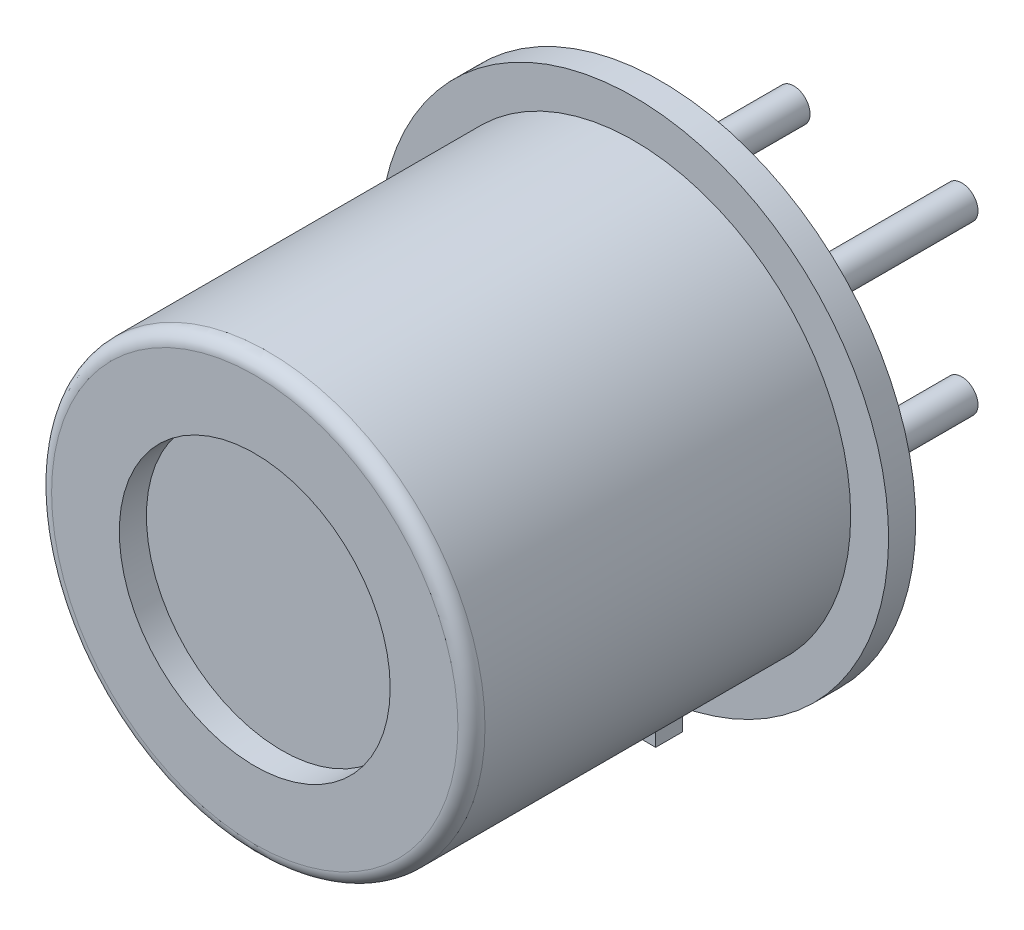
ISO-10303-21;
HEADER;
FILE_DESCRIPTION(('STEP AP214'),'2;1');
FILE_NAME('part.step','',(''),(''),'','','');
FILE_SCHEMA(('AUTOMOTIVE_DESIGN { 1 0 10303 214 1 1 1 1 }'));
ENDSEC;
DATA;
#1=APPLICATION_CONTEXT('core data for automotive mechanical design processes');
#2=APPLICATION_PROTOCOL_DEFINITION('international standard','automotive_design',2000,#1);
#3=PRODUCT_CONTEXT('',#1,'mechanical');
#4=PRODUCT('Part','Part','',(#3));
#5=PRODUCT_RELATED_PRODUCT_CATEGORY('part','',(#4));
#6=PRODUCT_DEFINITION_FORMATION('','',#4);
#7=PRODUCT_DEFINITION_CONTEXT('part definition',#1,'design');
#8=PRODUCT_DEFINITION('design','',#6,#7);
#9=PRODUCT_DEFINITION_SHAPE('','',#8);
#10=(LENGTH_UNIT() NAMED_UNIT(*) SI_UNIT(.MILLI.,.METRE.));
#11=(NAMED_UNIT(*) PLANE_ANGLE_UNIT() SI_UNIT($,.RADIAN.));
#12=(NAMED_UNIT(*) SI_UNIT($,.STERADIAN.) SOLID_ANGLE_UNIT());
#13=UNCERTAINTY_MEASURE_WITH_UNIT(LENGTH_MEASURE(1.E-05),#10,'distance_accuracy_value','');
#14=(GEOMETRIC_REPRESENTATION_CONTEXT(3) GLOBAL_UNCERTAINTY_ASSIGNED_CONTEXT((#13)) GLOBAL_UNIT_ASSIGNED_CONTEXT((#10,
#11,#12)) REPRESENTATION_CONTEXT('',''));
#15=CARTESIAN_POINT('',(0.,0.,0.));
#16=DIRECTION('',(0.,0.,1.));
#17=DIRECTION('',(1.,0.,0.));
#18=AXIS2_PLACEMENT_3D('',#15,#16,#17);
#19=CARTESIAN_POINT('',(-1.55,1.55,-2.));
#20=DIRECTION('',(0.,0.,1.));
#21=DIRECTION('',(1.,0.,0.));
#22=AXIS2_PLACEMENT_3D('',#19,#20,#21);
#23=CYLINDRICAL_SURFACE('',#22,0.3);
#24=CARTESIAN_POINT('',(-1.55,1.55,-2.));
#25=DIRECTION('',(0.,0.,1.));
#26=DIRECTION('',(1.,0.,0.));
#27=AXIS2_PLACEMENT_3D('',#24,#25,#26);
#28=CIRCLE('',#27,0.3);
#29=CARTESIAN_POINT('',(-1.25,1.55,-2.));
#30=VERTEX_POINT('',#29);
#31=EDGE_CURVE('E124',#30,#30,#28,.T.);
#32=ORIENTED_EDGE('',*,*,#31,.T.);
#33=EDGE_LOOP('',(#32));
#34=FACE_BOUND('',#33,.T.);
#35=CARTESIAN_POINT('',(-1.55,1.55,2.));
#36=DIRECTION('',(0.,0.,1.));
#37=DIRECTION('',(1.,0.,0.));
#38=AXIS2_PLACEMENT_3D('',#35,#36,#37);
#39=CIRCLE('',#38,0.3);
#40=CARTESIAN_POINT('',(-1.25,1.55,2.));
#41=VERTEX_POINT('',#40);
#42=EDGE_CURVE('E121',#41,#41,#39,.T.);
#43=ORIENTED_EDGE('',*,*,#42,.F.);
#44=EDGE_LOOP('',(#43));
#45=FACE_BOUND('',#44,.T.);
#46=ADVANCED_FACE('F42',(#34,#45),#23,.T.);
#47=CARTESIAN_POINT('',(-1.55,1.55,-2.));
#48=DIRECTION('',(0.,0.,1.));
#49=DIRECTION('',(1.,0.,0.));
#50=AXIS2_PLACEMENT_3D('',#47,#48,#49);
#51=PLANE('',#50);
#52=ORIENTED_EDGE('',*,*,#31,.F.);
#53=EDGE_LOOP('',(#52));
#54=FACE_BOUND('',#53,.T.);
#55=ADVANCED_FACE('F176',(#54),#51,.F.);
#56=CARTESIAN_POINT('',(0.,-5.5,2.5));
#57=DIRECTION('',(0.,1.,0.));
#58=DIRECTION('',(0.,0.,1.));
#59=AXIS2_PLACEMENT_3D('',#56,#57,#58);
#60=PLANE('',#59);
#61=DIRECTION('',(1.,0.,0.));
#62=VECTOR('',#61,1.);
#63=CARTESIAN_POINT('',(0.,-5.5,2.));
#64=LINE('',#63,#62);
#65=CARTESIAN_POINT('',(-0.4,-5.5,2.));
#66=VERTEX_POINT('',#65);
#67=CARTESIAN_POINT('',(0.4,-5.5,2.));
#68=VERTEX_POINT('',#67);
#69=EDGE_CURVE('E83',#66,#68,#64,.T.);
#70=ORIENTED_EDGE('',*,*,#69,.T.);
#71=DIRECTION('',(0.,0.,-1.));
#72=VECTOR('',#71,1.);
#73=CARTESIAN_POINT('',(0.4,-5.5,2.5));
#74=LINE('',#73,#72);
#75=CARTESIAN_POINT('',(0.4,-5.5,2.5));
#76=VERTEX_POINT('',#75);
#77=EDGE_CURVE('E102',#76,#68,#74,.T.);
#78=ORIENTED_EDGE('',*,*,#77,.F.);
#79=DIRECTION('',(1.,0.,0.));
#80=VECTOR('',#79,1.);
#81=CARTESIAN_POINT('',(0.,-5.5,2.5));
#82=LINE('',#81,#80);
#83=CARTESIAN_POINT('',(-0.4,-5.5,2.5));
#84=VERTEX_POINT('',#83);
#85=EDGE_CURVE('E88',#84,#76,#82,.T.);
#86=ORIENTED_EDGE('',*,*,#85,.F.);
#87=DIRECTION('',(0.,0.,-1.));
#88=VECTOR('',#87,1.);
#89=CARTESIAN_POINT('',(-0.4,-5.5,2.5));
#90=LINE('',#89,#88);
#91=EDGE_CURVE('E107',#84,#66,#90,.T.);
#92=ORIENTED_EDGE('',*,*,#91,.T.);
#93=EDGE_LOOP('',(#70,#78,#86,#92));
#94=FACE_BOUND('',#93,.T.);
#95=ADVANCED_FACE('F181',(#94),#60,.F.);
#96=CARTESIAN_POINT('',(0.4,-5.5,2.5));
#97=DIRECTION('',(-1.,0.,0.));
#98=DIRECTION('',(0.,-1.,0.));
#99=AXIS2_PLACEMENT_3D('',#96,#97,#98);
#100=PLANE('',#99);
#101=DIRECTION('',(0.,1.,0.));
#102=VECTOR('',#101,1.);
#103=CARTESIAN_POINT('',(0.4,-5.5,2.));
#104=LINE('',#103,#102);
#105=CARTESIAN_POINT('',(0.4,-4.68294778958724,2.));
#106=VERTEX_POINT('',#105);
#107=EDGE_CURVE('E101',#68,#106,#104,.T.);
#108=ORIENTED_EDGE('',*,*,#107,.T.);
#109=DIRECTION('',(0.,0.,-1.));
#110=VECTOR('',#109,1.);
#111=CARTESIAN_POINT('',(0.4,-4.68294778958724,2.5));
#112=LINE('',#111,#110);
#113=CARTESIAN_POINT('',(0.4,-4.68294778958724,2.5));
#114=VERTEX_POINT('',#113);
#115=EDGE_CURVE('E99',#114,#106,#112,.T.);
#116=ORIENTED_EDGE('',*,*,#115,.F.);
#117=DIRECTION('',(0.,1.,0.));
#118=VECTOR('',#117,1.);
#119=CARTESIAN_POINT('',(0.4,-5.5,2.5));
#120=LINE('',#119,#118);
#121=EDGE_CURVE('E91',#76,#114,#120,.T.);
#122=ORIENTED_EDGE('',*,*,#121,.F.);
#123=ORIENTED_EDGE('',*,*,#77,.T.);
#124=EDGE_LOOP('',(#108,#116,#122,#123));
#125=FACE_BOUND('',#124,.T.);
#126=ADVANCED_FACE('F100',(#125),#100,.F.);
#127=CARTESIAN_POINT('',(0.,0.,2.5));
#128=DIRECTION('',(0.,0.,-1.));
#129=DIRECTION('',(-1.,0.,0.));
#130=AXIS2_PLACEMENT_3D('',#127,#128,#129);
#131=CYLINDRICAL_SURFACE('',#130,4.7);
#132=CARTESIAN_POINT('',(0.,0.,2.));
#133=DIRECTION('',(0.,0.,1.));
#134=DIRECTION('',(1.,0.,0.));
#135=AXIS2_PLACEMENT_3D('',#132,#133,#134);
#136=CIRCLE('',#135,4.7);
#137=CARTESIAN_POINT('',(-0.399999999999997,-4.68294778958724,2.));
#138=VERTEX_POINT('',#137);
#139=EDGE_CURVE('E76',#106,#138,#136,.T.);
#140=ORIENTED_EDGE('',*,*,#139,.T.);
#141=DIRECTION('',(0.,0.,-1.));
#142=VECTOR('',#141,1.);
#143=CARTESIAN_POINT('',(-0.399999999999997,-4.68294778958724,2.5));
#144=LINE('',#143,#142);
#145=CARTESIAN_POINT('',(-0.399999999999997,-4.68294778958724,2.5));
#146=VERTEX_POINT('',#145);
#147=EDGE_CURVE('E103',#146,#138,#144,.T.);
#148=ORIENTED_EDGE('',*,*,#147,.F.);
#149=CARTESIAN_POINT('',(0.,0.,2.5));
#150=DIRECTION('',(0.,0.,1.));
#151=DIRECTION('',(1.,0.,0.));
#152=AXIS2_PLACEMENT_3D('',#149,#150,#151);
#153=CIRCLE('',#152,4.7);
#154=EDGE_CURVE('E95',#114,#146,#153,.T.);
#155=ORIENTED_EDGE('',*,*,#154,.F.);
#156=ORIENTED_EDGE('',*,*,#115,.T.);
#157=EDGE_LOOP('',(#140,#148,#155,#156));
#158=FACE_BOUND('',#157,.T.);
#159=ADVANCED_FACE('F105',(#158),#131,.T.);
#160=CARTESIAN_POINT('',(-0.4,-5.5,2.5));
#161=DIRECTION('',(1.,0.,0.));
#162=DIRECTION('',(0.,1.,0.));
#163=AXIS2_PLACEMENT_3D('',#160,#161,#162);
#164=PLANE('',#163);
#165=DIRECTION('',(0.,-1.,0.));
#166=VECTOR('',#165,1.);
#167=CARTESIAN_POINT('',(-0.4,-5.5,2.));
#168=LINE('',#167,#166);
#169=EDGE_CURVE('E115',#138,#66,#168,.T.);
#170=ORIENTED_EDGE('',*,*,#169,.T.);
#171=ORIENTED_EDGE('',*,*,#91,.F.);
#172=DIRECTION('',(0.,-1.,0.));
#173=VECTOR('',#172,1.);
#174=CARTESIAN_POINT('',(-0.4,-5.5,2.5));
#175=LINE('',#174,#173);
#176=EDGE_CURVE('E59',#146,#84,#175,.T.);
#177=ORIENTED_EDGE('',*,*,#176,.F.);
#178=ORIENTED_EDGE('',*,*,#147,.T.);
#179=EDGE_LOOP('',(#170,#171,#177,#178));
#180=FACE_BOUND('',#179,.T.);
#181=ADVANCED_FACE('F193',(#180),#164,.F.);
#182=CARTESIAN_POINT('',(0.,0.,2.5));
#183=DIRECTION('',(0.,0.,1.));
#184=DIRECTION('',(1.,0.,0.));
#185=AXIS2_PLACEMENT_3D('',#182,#183,#184);
#186=PLANE('',#185);
#187=CARTESIAN_POINT('',(0.,0.,2.5));
#188=DIRECTION('',(0.,0.,1.));
#189=DIRECTION('',(1.,0.,0.));
#190=AXIS2_PLACEMENT_3D('',#187,#188,#189);
#191=CIRCLE('',#190,4.);
#192=CARTESIAN_POINT('',(4.,0.,2.5));
#193=VERTEX_POINT('',#192);
#194=EDGE_CURVE('E126',#193,#193,#191,.T.);
#195=ORIENTED_EDGE('',*,*,#194,.F.);
#196=EDGE_LOOP('',(#195));
#197=FACE_BOUND('',#196,.T.);
#198=ORIENTED_EDGE('',*,*,#85,.T.);
#199=ORIENTED_EDGE('',*,*,#121,.T.);
#200=ORIENTED_EDGE('',*,*,#154,.T.);
#201=ORIENTED_EDGE('',*,*,#176,.T.);
#202=EDGE_LOOP('',(#198,#199,#200,#201));
#203=FACE_BOUND('',#202,.T.);
#204=ADVANCED_FACE('F93',(#197,#203),#186,.T.);
#205=CARTESIAN_POINT('',(0.,0.,2.));
#206=DIRECTION('',(0.,0.,1.));
#207=DIRECTION('',(1.,0.,0.));
#208=AXIS2_PLACEMENT_3D('',#205,#206,#207);
#209=PLANE('',#208);
#210=CARTESIAN_POINT('',(1.55,-1.55,2.));
#211=DIRECTION('',(0.,0.,1.));
#212=DIRECTION('',(1.,0.,0.));
#213=AXIS2_PLACEMENT_3D('',#210,#211,#212);
#214=CIRCLE('',#213,0.3);
#215=CARTESIAN_POINT('',(1.85,-1.55,2.));
#216=VERTEX_POINT('',#215);
#217=EDGE_CURVE('E141',#216,#216,#214,.T.);
#218=ORIENTED_EDGE('',*,*,#217,.T.);
#219=EDGE_LOOP('',(#218));
#220=FACE_BOUND('',#219,.T.);
#221=CARTESIAN_POINT('',(1.55,1.55,2.));
#222=DIRECTION('',(0.,0.,1.));
#223=DIRECTION('',(1.,0.,0.));
#224=AXIS2_PLACEMENT_3D('',#221,#222,#223);
#225=CIRCLE('',#224,0.3);
#226=CARTESIAN_POINT('',(1.85,1.55,2.));
#227=VERTEX_POINT('',#226);
#228=EDGE_CURVE('E148',#227,#227,#225,.T.);
#229=ORIENTED_EDGE('',*,*,#228,.T.);
#230=EDGE_LOOP('',(#229));
#231=FACE_BOUND('',#230,.T.);
#232=CARTESIAN_POINT('',(-1.55,-1.55,2.));
#233=DIRECTION('',(0.,0.,1.));
#234=DIRECTION('',(1.,0.,0.));
#235=AXIS2_PLACEMENT_3D('',#232,#233,#234);
#236=CIRCLE('',#235,0.3);
#237=CARTESIAN_POINT('',(-1.25,-1.55,2.));
#238=VERTEX_POINT('',#237);
#239=EDGE_CURVE('E112',#238,#238,#236,.T.);
#240=ORIENTED_EDGE('',*,*,#239,.T.);
#241=EDGE_LOOP('',(#240));
#242=FACE_BOUND('',#241,.T.);
#243=ORIENTED_EDGE('',*,*,#42,.T.);
#244=EDGE_LOOP('',(#243));
#245=FACE_BOUND('',#244,.T.);
#246=ORIENTED_EDGE('',*,*,#69,.F.);
#247=ORIENTED_EDGE('',*,*,#169,.F.);
#248=ORIENTED_EDGE('',*,*,#139,.F.);
#249=ORIENTED_EDGE('',*,*,#107,.F.);
#250=EDGE_LOOP('',(#246,#247,#248,#249));
#251=FACE_BOUND('',#250,.T.);
#252=ADVANCED_FACE('F157',(#220,#231,#242,#245,#251),#209,.F.);
#253=CARTESIAN_POINT('',(-1.55,-1.55,-2.));
#254=DIRECTION('',(0.,0.,1.));
#255=DIRECTION('',(1.,0.,0.));
#256=AXIS2_PLACEMENT_3D('',#253,#254,#255);
#257=CYLINDRICAL_SURFACE('',#256,0.3);
#258=CARTESIAN_POINT('',(-1.55,-1.55,-2.));
#259=DIRECTION('',(0.,0.,1.));
#260=DIRECTION('',(1.,0.,0.));
#261=AXIS2_PLACEMENT_3D('',#258,#259,#260);
#262=CIRCLE('',#261,0.3);
#263=CARTESIAN_POINT('',(-1.25,-1.55,-2.));
#264=VERTEX_POINT('',#263);
#265=EDGE_CURVE('E151',#264,#264,#262,.T.);
#266=ORIENTED_EDGE('',*,*,#265,.T.);
#267=EDGE_LOOP('',(#266));
#268=FACE_BOUND('',#267,.T.);
#269=ORIENTED_EDGE('',*,*,#239,.F.);
#270=EDGE_LOOP('',(#269));
#271=FACE_BOUND('',#270,.T.);
#272=ADVANCED_FACE('F160',(#268,#271),#257,.T.);
#273=CARTESIAN_POINT('',(-1.55,-1.55,-2.));
#274=DIRECTION('',(0.,0.,1.));
#275=DIRECTION('',(1.,0.,0.));
#276=AXIS2_PLACEMENT_3D('',#273,#274,#275);
#277=PLANE('',#276);
#278=ORIENTED_EDGE('',*,*,#265,.F.);
#279=EDGE_LOOP('',(#278));
#280=FACE_BOUND('',#279,.T.);
#281=ADVANCED_FACE('F162',(#280),#277,.F.);
#282=CARTESIAN_POINT('',(1.55,1.55,-2.));
#283=DIRECTION('',(0.,0.,1.));
#284=DIRECTION('',(1.,0.,0.));
#285=AXIS2_PLACEMENT_3D('',#282,#283,#284);
#286=CYLINDRICAL_SURFACE('',#285,0.3);
#287=CARTESIAN_POINT('',(1.55,1.55,-2.));
#288=DIRECTION('',(0.,0.,1.));
#289=DIRECTION('',(1.,0.,0.));
#290=AXIS2_PLACEMENT_3D('',#287,#288,#289);
#291=CIRCLE('',#290,0.3);
#292=CARTESIAN_POINT('',(1.85,1.55,-2.));
#293=VERTEX_POINT('',#292);
#294=EDGE_CURVE('E145',#293,#293,#291,.T.);
#295=ORIENTED_EDGE('',*,*,#294,.T.);
#296=EDGE_LOOP('',(#295));
#297=FACE_BOUND('',#296,.T.);
#298=ORIENTED_EDGE('',*,*,#228,.F.);
#299=EDGE_LOOP('',(#298));
#300=FACE_BOUND('',#299,.T.);
#301=ADVANCED_FACE('F169',(#297,#300),#286,.T.);
#302=CARTESIAN_POINT('',(1.55,1.55,-2.));
#303=DIRECTION('',(0.,0.,1.));
#304=DIRECTION('',(1.,0.,0.));
#305=AXIS2_PLACEMENT_3D('',#302,#303,#304);
#306=PLANE('',#305);
#307=ORIENTED_EDGE('',*,*,#294,.F.);
#308=EDGE_LOOP('',(#307));
#309=FACE_BOUND('',#308,.T.);
#310=ADVANCED_FACE('F331',(#309),#306,.F.);
#311=CARTESIAN_POINT('',(1.55,-1.55,-2.));
#312=DIRECTION('',(0.,0.,1.));
#313=DIRECTION('',(1.,0.,0.));
#314=AXIS2_PLACEMENT_3D('',#311,#312,#313);
#315=CYLINDRICAL_SURFACE('',#314,0.3);
#316=CARTESIAN_POINT('',(1.55,-1.55,-2.));
#317=DIRECTION('',(0.,0.,1.));
#318=DIRECTION('',(1.,0.,0.));
#319=AXIS2_PLACEMENT_3D('',#316,#317,#318);
#320=CIRCLE('',#319,0.3);
#321=CARTESIAN_POINT('',(1.85,-1.55,-2.));
#322=VERTEX_POINT('',#321);
#323=EDGE_CURVE('E138',#322,#322,#320,.T.);
#324=ORIENTED_EDGE('',*,*,#323,.T.);
#325=EDGE_LOOP('',(#324));
#326=FACE_BOUND('',#325,.T.);
#327=ORIENTED_EDGE('',*,*,#217,.F.);
#328=EDGE_LOOP('',(#327));
#329=FACE_BOUND('',#328,.T.);
#330=ADVANCED_FACE('F323',(#326,#329),#315,.T.);
#331=CARTESIAN_POINT('',(1.55,-1.55,-2.));
#332=DIRECTION('',(0.,0.,1.));
#333=DIRECTION('',(1.,0.,0.));
#334=AXIS2_PLACEMENT_3D('',#331,#332,#333);
#335=PLANE('',#334);
#336=ORIENTED_EDGE('',*,*,#323,.F.);
#337=EDGE_LOOP('',(#336));
#338=FACE_BOUND('',#337,.T.);
#339=ADVANCED_FACE('F268',(#338),#335,.F.);
#340=CARTESIAN_POINT('',(0.,0.,9.5));
#341=DIRECTION('',(0.,0.,-1.));
#342=DIRECTION('',(-1.,0.,0.));
#343=AXIS2_PLACEMENT_3D('',#340,#341,#342);
#344=CYLINDRICAL_SURFACE('',#343,4.);
#345=CARTESIAN_POINT('',(0.,0.,9.25));
#346=DIRECTION('',(0.,0.,1.));
#347=DIRECTION('',(1.,0.,0.));
#348=AXIS2_PLACEMENT_3D('',#345,#346,#347);
#349=CIRCLE('',#348,4.);
#350=CARTESIAN_POINT('',(4.,0.,9.25));
#351=VERTEX_POINT('',#350);
#352=EDGE_CURVE('E11',#351,#351,#349,.F.);
#353=ORIENTED_EDGE('',*,*,#352,.T.);
#354=EDGE_LOOP('',(#353));
#355=FACE_BOUND('',#354,.T.);
#356=ORIENTED_EDGE('',*,*,#194,.T.);
#357=EDGE_LOOP('',(#356));
#358=FACE_BOUND('',#357,.T.);
#359=ADVANCED_FACE('F262',(#355,#358),#344,.T.);
#360=CARTESIAN_POINT('',(0.,0.,9.5));
#361=DIRECTION('',(0.,0.,1.));
#362=DIRECTION('',(1.,0.,0.));
#363=AXIS2_PLACEMENT_3D('',#360,#361,#362);
#364=PLANE('',#363);
#365=CARTESIAN_POINT('',(0.,0.,9.5));
#366=DIRECTION('',(0.,0.,1.));
#367=DIRECTION('',(1.,0.,0.));
#368=AXIS2_PLACEMENT_3D('',#365,#366,#367);
#369=CIRCLE('',#368,2.5);
#370=CARTESIAN_POINT('',(2.5,0.,9.5));
#371=VERTEX_POINT('',#370);
#372=EDGE_CURVE('E136',#371,#371,#369,.T.);
#373=ORIENTED_EDGE('',*,*,#372,.F.);
#374=EDGE_LOOP('',(#373));
#375=FACE_BOUND('',#374,.T.);
#376=CARTESIAN_POINT('',(0.,0.,9.5));
#377=DIRECTION('',(0.,0.,1.));
#378=DIRECTION('',(1.,0.,0.));
#379=AXIS2_PLACEMENT_3D('',#376,#377,#378);
#380=CIRCLE('',#379,3.75);
#381=CARTESIAN_POINT('',(3.75,0.,9.5));
#382=VERTEX_POINT('',#381);
#383=EDGE_CURVE('E51',#382,#382,#380,.T.);
#384=ORIENTED_EDGE('',*,*,#383,.T.);
#385=EDGE_LOOP('',(#384));
#386=FACE_BOUND('',#385,.T.);
#387=ADVANCED_FACE('F267',(#375,#386),#364,.T.);
#388=CARTESIAN_POINT('',(0.,0.,9.25));
#389=DIRECTION('',(0.,0.,1.));
#390=DIRECTION('',(1.,0.,0.));
#391=AXIS2_PLACEMENT_3D('',#388,#389,#390);
#392=TOROIDAL_SURFACE('',#391,3.75,0.25);
#393=ORIENTED_EDGE('',*,*,#352,.F.);
#394=EDGE_LOOP('',(#393));
#395=FACE_BOUND('',#394,.T.);
#396=ORIENTED_EDGE('',*,*,#383,.F.);
#397=EDGE_LOOP('',(#396));
#398=FACE_BOUND('',#397,.T.);
#399=ADVANCED_FACE('F44',(#395,#398),#392,.T.);
#400=CARTESIAN_POINT('',(0.,0.,9.));
#401=DIRECTION('',(0.,0.,1.));
#402=DIRECTION('',(1.,0.,0.));
#403=AXIS2_PLACEMENT_3D('',#400,#401,#402);
#404=CYLINDRICAL_SURFACE('',#403,2.5);
#405=CARTESIAN_POINT('',(0.,0.,9.));
#406=DIRECTION('',(0.,0.,1.));
#407=DIRECTION('',(1.,0.,0.));
#408=AXIS2_PLACEMENT_3D('',#405,#406,#407);
#409=CIRCLE('',#408,2.5);
#410=CARTESIAN_POINT('',(2.5,0.,9.));
#411=VERTEX_POINT('',#410);
#412=EDGE_CURVE('E142',#411,#411,#409,.T.);
#413=ORIENTED_EDGE('',*,*,#412,.F.);
#414=EDGE_LOOP('',(#413));
#415=FACE_BOUND('',#414,.T.);
#416=ORIENTED_EDGE('',*,*,#372,.T.);
#417=EDGE_LOOP('',(#416));
#418=FACE_BOUND('',#417,.T.);
#419=ADVANCED_FACE('F291',(#415,#418),#404,.F.);
#420=CARTESIAN_POINT('',(0.,0.,9.));
#421=DIRECTION('',(0.,0.,1.));
#422=DIRECTION('',(1.,0.,0.));
#423=AXIS2_PLACEMENT_3D('',#420,#421,#422);
#424=PLANE('',#423);
#425=ORIENTED_EDGE('',*,*,#412,.T.);
#426=EDGE_LOOP('',(#425));
#427=FACE_BOUND('',#426,.T.);
#428=ADVANCED_FACE('F301',(#427),#424,.T.);
#429=CLOSED_SHELL('',(#46,#55,#95,#126,#159,#181,#204,#252,#272,#281,#301,#310,#330,#339,#359,
#387,#399,#419,#428));
#430=MANIFOLD_SOLID_BREP('B2',#429);
#431=ADVANCED_BREP_SHAPE_REPRESENTATION('',(#18,#430),#14);
#432=SHAPE_DEFINITION_REPRESENTATION(#9,#431);
ENDSEC;
END-ISO-10303-21;
